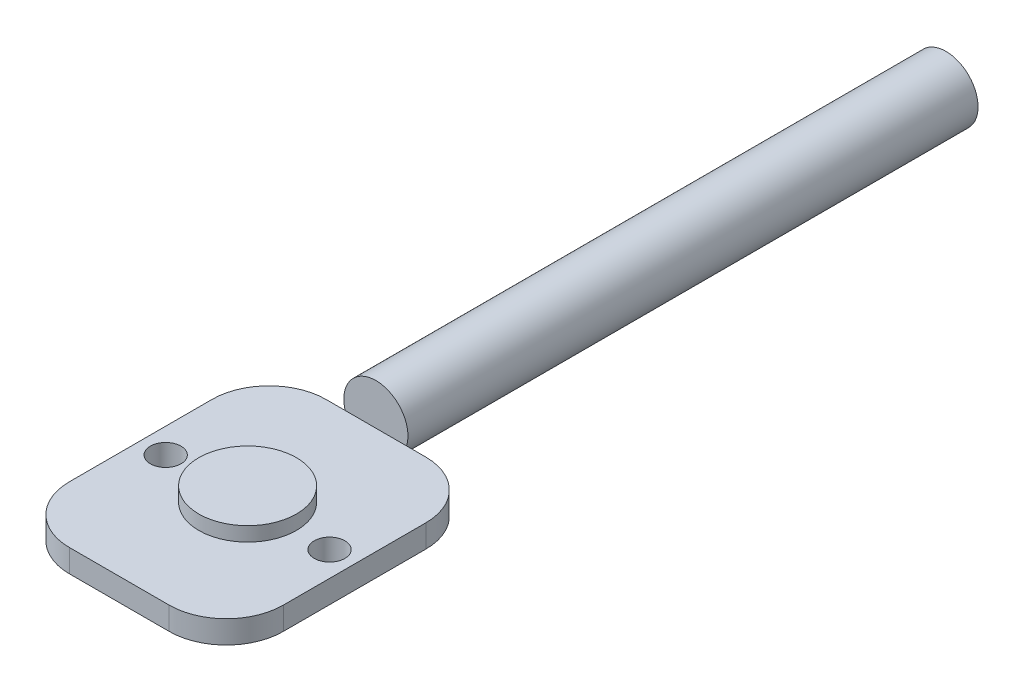
ISO-10303-21;
HEADER;
FILE_DESCRIPTION(('STEP AP214'),'2;1');
FILE_NAME('part.step','',(''),(''),'','','');
FILE_SCHEMA(('AUTOMOTIVE_DESIGN { 1 0 10303 214 1 1 1 1 }'));
ENDSEC;
DATA;
#1=APPLICATION_CONTEXT('core data for automotive mechanical design processes');
#2=APPLICATION_PROTOCOL_DEFINITION('international standard','automotive_design',2000,#1);
#3=PRODUCT_CONTEXT('',#1,'mechanical');
#4=PRODUCT('Part','Part','',(#3));
#5=PRODUCT_RELATED_PRODUCT_CATEGORY('part','',(#4));
#6=PRODUCT_DEFINITION_FORMATION('','',#4);
#7=PRODUCT_DEFINITION_CONTEXT('part definition',#1,'design');
#8=PRODUCT_DEFINITION('design','',#6,#7);
#9=PRODUCT_DEFINITION_SHAPE('','',#8);
#10=(LENGTH_UNIT() NAMED_UNIT(*) SI_UNIT(.MILLI.,.METRE.));
#11=(NAMED_UNIT(*) PLANE_ANGLE_UNIT() SI_UNIT($,.RADIAN.));
#12=(NAMED_UNIT(*) SI_UNIT($,.STERADIAN.) SOLID_ANGLE_UNIT());
#13=UNCERTAINTY_MEASURE_WITH_UNIT(LENGTH_MEASURE(1.E-05),#10,'distance_accuracy_value','');
#14=(GEOMETRIC_REPRESENTATION_CONTEXT(3) GLOBAL_UNCERTAINTY_ASSIGNED_CONTEXT((#13)) GLOBAL_UNIT_ASSIGNED_CONTEXT((#10,
#11,#12)) REPRESENTATION_CONTEXT('',''));
#15=CARTESIAN_POINT('',(0.,0.,0.));
#16=DIRECTION('',(0.,0.,1.));
#17=DIRECTION('',(1.,0.,0.));
#18=AXIS2_PLACEMENT_3D('',#15,#16,#17);
#19=CARTESIAN_POINT('',(0.,2.25,-49.));
#20=DIRECTION('',(0.,0.,1.));
#21=DIRECTION('',(1.,0.,0.));
#22=AXIS2_PLACEMENT_3D('',#19,#20,#21);
#23=CYLINDRICAL_SURFACE('',#22,2.25);
#24=CARTESIAN_POINT('',(0.,2.25,-49.));
#25=DIRECTION('',(0.,0.,-1.));
#26=DIRECTION('',(-1.,0.,0.));
#27=AXIS2_PLACEMENT_3D('',#24,#25,#26);
#28=CIRCLE('',#27,2.25);
#29=CARTESIAN_POINT('',(-2.25,2.25,-49.));
#30=VERTEX_POINT('',#29);
#31=EDGE_CURVE('E11',#30,#30,#28,.T.);
#32=ORIENTED_EDGE('',*,*,#31,.F.);
#33=EDGE_LOOP('',(#32));
#34=FACE_BOUND('',#33,.T.);
#35=CARTESIAN_POINT('',(0.,2.25,-9.));
#36=DIRECTION('',(0.,0.,-1.));
#37=DIRECTION('',(-1.,0.,0.));
#38=AXIS2_PLACEMENT_3D('',#35,#36,#37);
#39=CIRCLE('',#38,2.25);
#40=CARTESIAN_POINT('',(-2.25,2.25,-9.));
#41=VERTEX_POINT('',#40);
#42=EDGE_CURVE('E50',#41,#41,#39,.T.);
#43=ORIENTED_EDGE('',*,*,#42,.T.);
#44=EDGE_LOOP('',(#43));
#45=FACE_BOUND('',#44,.T.);
#46=ADVANCED_FACE('F47',(#34,#45),#23,.T.);
#47=CARTESIAN_POINT('',(0.,2.25,-49.));
#48=DIRECTION('',(0.,0.,-1.));
#49=DIRECTION('',(-1.,0.,0.));
#50=AXIS2_PLACEMENT_3D('',#47,#48,#49);
#51=PLANE('',#50);
#52=ORIENTED_EDGE('',*,*,#31,.T.);
#53=EDGE_LOOP('',(#52));
#54=FACE_BOUND('',#53,.T.);
#55=ADVANCED_FACE('F62',(#54),#51,.T.);
#56=CARTESIAN_POINT('',(0.,2.25,-9.));
#57=DIRECTION('',(0.,0.,-1.));
#58=DIRECTION('',(-1.,0.,0.));
#59=AXIS2_PLACEMENT_3D('',#56,#57,#58);
#60=PLANE('',#59);
#61=ORIENTED_EDGE('',*,*,#42,.F.);
#62=EDGE_LOOP('',(#61));
#63=FACE_BOUND('',#62,.T.);
#64=ADVANCED_FACE('F60',(#63),#60,.F.);
#65=CLOSED_SHELL('',(#46,#55,#64));
#66=MANIFOLD_SOLID_BREP('B2',#65);
#67=CARTESIAN_POINT('',(-3.5,1.6,5.));
#68=DIRECTION('',(0.,-1.,0.));
#69=DIRECTION('',(0.,0.,-1.));
#70=AXIS2_PLACEMENT_3D('',#67,#68,#69);
#71=PLANE('',#70);
#72=CARTESIAN_POINT('',(0.,1.6,0.));
#73=DIRECTION('',(0.,1.,0.));
#74=DIRECTION('',(0.,0.,1.));
#75=AXIS2_PLACEMENT_3D('',#72,#73,#74);
#76=CIRCLE('',#75,3.42647578680288);
#77=CARTESIAN_POINT('',(0.,1.6,3.42647578680288));
#78=VERTEX_POINT('',#77);
#79=EDGE_CURVE('E45',#78,#78,#76,.T.);
#80=ORIENTED_EDGE('',*,*,#79,.F.);
#81=EDGE_LOOP('',(#80));
#82=FACE_BOUND('',#81,.T.);
#83=CARTESIAN_POINT('',(-3.5,1.6,5.));
#84=DIRECTION('',(0.,1.,0.));
#85=DIRECTION('',(0.,0.,-1.));
#86=AXIS2_PLACEMENT_3D('',#83,#84,#85);
#87=CIRCLE('',#86,4.);
#88=CARTESIAN_POINT('',(-7.5,1.6,4.99999999999997));
#89=VERTEX_POINT('',#88);
#90=CARTESIAN_POINT('',(-3.49999999999997,1.6,9.));
#91=VERTEX_POINT('',#90);
#92=EDGE_CURVE('E207',#89,#91,#87,.T.);
#93=ORIENTED_EDGE('',*,*,#92,.T.);
#94=DIRECTION('',(1.,0.,0.));
#95=VECTOR('',#94,1.);
#96=CARTESIAN_POINT('',(3.49999999999997,1.6,9.));
#97=LINE('',#96,#95);
#98=CARTESIAN_POINT('',(3.49999999999997,1.6,9.));
#99=VERTEX_POINT('',#98);
#100=EDGE_CURVE('E155',#91,#99,#97,.T.);
#101=ORIENTED_EDGE('',*,*,#100,.T.);
#102=CARTESIAN_POINT('',(3.5,1.6,5.));
#103=DIRECTION('',(0.,1.,0.));
#104=DIRECTION('',(0.,0.,-1.));
#105=AXIS2_PLACEMENT_3D('',#102,#103,#104);
#106=CIRCLE('',#105,4.);
#107=CARTESIAN_POINT('',(7.5,1.6,4.99999999999997));
#108=VERTEX_POINT('',#107);
#109=EDGE_CURVE('E238',#99,#108,#106,.T.);
#110=ORIENTED_EDGE('',*,*,#109,.T.);
#111=DIRECTION('',(0.,0.,-1.));
#112=VECTOR('',#111,1.);
#113=CARTESIAN_POINT('',(7.5,1.6,-4.99999999999998));
#114=LINE('',#113,#112);
#115=CARTESIAN_POINT('',(7.5,1.6,-4.99999999999998));
#116=VERTEX_POINT('',#115);
#117=EDGE_CURVE('E237',#108,#116,#114,.T.);
#118=ORIENTED_EDGE('',*,*,#117,.T.);
#119=CARTESIAN_POINT('',(3.5,1.6,-5.));
#120=DIRECTION('',(0.,1.,0.));
#121=DIRECTION('',(0.,0.,1.));
#122=AXIS2_PLACEMENT_3D('',#119,#120,#121);
#123=CIRCLE('',#122,4.);
#124=CARTESIAN_POINT('',(3.49999999999997,1.6,-9.00000000000001));
#125=VERTEX_POINT('',#124);
#126=EDGE_CURVE('E174',#116,#125,#123,.T.);
#127=ORIENTED_EDGE('',*,*,#126,.T.);
#128=DIRECTION('',(-1.,0.,0.));
#129=VECTOR('',#128,1.);
#130=CARTESIAN_POINT('',(-3.49999999999997,1.6,-9.));
#131=LINE('',#130,#129);
#132=CARTESIAN_POINT('',(-3.49999999999997,1.6,-9.));
#133=VERTEX_POINT('',#132);
#134=EDGE_CURVE('E168',#125,#133,#131,.T.);
#135=ORIENTED_EDGE('',*,*,#134,.T.);
#136=CARTESIAN_POINT('',(-3.5,1.6,-5.));
#137=DIRECTION('',(0.,1.,0.));
#138=DIRECTION('',(0.,0.,1.));
#139=AXIS2_PLACEMENT_3D('',#136,#137,#138);
#140=CIRCLE('',#139,4.);
#141=CARTESIAN_POINT('',(-7.5,1.6,-4.99999999999998));
#142=VERTEX_POINT('',#141);
#143=EDGE_CURVE('E172',#133,#142,#140,.T.);
#144=ORIENTED_EDGE('',*,*,#143,.T.);
#145=DIRECTION('',(0.,0.,1.));
#146=VECTOR('',#145,1.);
#147=CARTESIAN_POINT('',(-7.5,1.6,4.99999999999997));
#148=LINE('',#147,#146);
#149=EDGE_CURVE('E111',#142,#89,#148,.T.);
#150=ORIENTED_EDGE('',*,*,#149,.T.);
#151=EDGE_LOOP('',(#93,#101,#110,#118,#127,#135,#144,#150));
#152=FACE_BOUND('',#151,.T.);
#153=CARTESIAN_POINT('',(-5.75,1.6,0.));
#154=DIRECTION('',(0.,1.,0.));
#155=DIRECTION('',(0.,0.,1.));
#156=AXIS2_PLACEMENT_3D('',#153,#154,#155);
#157=CIRCLE('',#156,1.075);
#158=CARTESIAN_POINT('',(-5.75,1.6,1.075));
#159=VERTEX_POINT('',#158);
#160=EDGE_CURVE('E196',#159,#159,#157,.T.);
#161=ORIENTED_EDGE('',*,*,#160,.F.);
#162=EDGE_LOOP('',(#161));
#163=FACE_BOUND('',#162,.T.);
#164=CARTESIAN_POINT('',(5.75,1.6,0.));
#165=DIRECTION('',(0.,1.,0.));
#166=DIRECTION('',(0.,0.,1.));
#167=AXIS2_PLACEMENT_3D('',#164,#165,#166);
#168=CIRCLE('',#167,1.075);
#169=CARTESIAN_POINT('',(5.75,1.6,1.075));
#170=VERTEX_POINT('',#169);
#171=EDGE_CURVE('E247',#170,#170,#168,.T.);
#172=ORIENTED_EDGE('',*,*,#171,.F.);
#173=EDGE_LOOP('',(#172));
#174=FACE_BOUND('',#173,.T.);
#175=ADVANCED_FACE('F93',(#82,#152,#163,#174),#71,.F.);
#176=CARTESIAN_POINT('',(-3.5,0.,5.));
#177=DIRECTION('',(0.,-1.,0.));
#178=DIRECTION('',(0.,0.,-1.));
#179=AXIS2_PLACEMENT_3D('',#176,#177,#178);
#180=PLANE('',#179);
#181=CARTESIAN_POINT('',(-5.75,0.,0.));
#182=DIRECTION('',(0.,1.,0.));
#183=DIRECTION('',(0.,0.,1.));
#184=AXIS2_PLACEMENT_3D('',#181,#182,#183);
#185=CIRCLE('',#184,1.075);
#186=CARTESIAN_POINT('',(-5.75,0.,1.075));
#187=VERTEX_POINT('',#186);
#188=EDGE_CURVE('E244',#187,#187,#185,.T.);
#189=ORIENTED_EDGE('',*,*,#188,.T.);
#190=EDGE_LOOP('',(#189));
#191=FACE_BOUND('',#190,.T.);
#192=CARTESIAN_POINT('',(-3.5,0.,5.));
#193=DIRECTION('',(0.,1.,0.));
#194=DIRECTION('',(0.,0.,-1.));
#195=AXIS2_PLACEMENT_3D('',#192,#193,#194);
#196=CIRCLE('',#195,4.);
#197=CARTESIAN_POINT('',(-7.5,0.,4.99999999999997));
#198=VERTEX_POINT('',#197);
#199=CARTESIAN_POINT('',(-3.49999999999997,0.,9.));
#200=VERTEX_POINT('',#199);
#201=EDGE_CURVE('E192',#198,#200,#196,.T.);
#202=ORIENTED_EDGE('',*,*,#201,.F.);
#203=DIRECTION('',(0.,0.,1.));
#204=VECTOR('',#203,1.);
#205=CARTESIAN_POINT('',(-7.5,0.,4.99999999999997));
#206=LINE('',#205,#204);
#207=CARTESIAN_POINT('',(-7.5,0.,-4.99999999999998));
#208=VERTEX_POINT('',#207);
#209=EDGE_CURVE('E146',#208,#198,#206,.T.);
#210=ORIENTED_EDGE('',*,*,#209,.F.);
#211=CARTESIAN_POINT('',(-3.5,0.,-5.));
#212=DIRECTION('',(0.,1.,0.));
#213=DIRECTION('',(0.,0.,1.));
#214=AXIS2_PLACEMENT_3D('',#211,#212,#213);
#215=CIRCLE('',#214,4.);
#216=CARTESIAN_POINT('',(-3.49999999999997,0.,-9.));
#217=VERTEX_POINT('',#216);
#218=EDGE_CURVE('E140',#217,#208,#215,.T.);
#219=ORIENTED_EDGE('',*,*,#218,.F.);
#220=DIRECTION('',(-1.,0.,0.));
#221=VECTOR('',#220,1.);
#222=CARTESIAN_POINT('',(-3.49999999999997,0.,-9.));
#223=LINE('',#222,#221);
#224=CARTESIAN_POINT('',(3.49999999999997,0.,-9.00000000000001));
#225=VERTEX_POINT('',#224);
#226=EDGE_CURVE('E182',#225,#217,#223,.T.);
#227=ORIENTED_EDGE('',*,*,#226,.F.);
#228=CARTESIAN_POINT('',(3.5,0.,-5.));
#229=DIRECTION('',(0.,1.,0.));
#230=DIRECTION('',(0.,0.,1.));
#231=AXIS2_PLACEMENT_3D('',#228,#229,#230);
#232=CIRCLE('',#231,4.);
#233=CARTESIAN_POINT('',(7.5,0.,-4.99999999999998));
#234=VERTEX_POINT('',#233);
#235=EDGE_CURVE('E202',#234,#225,#232,.T.);
#236=ORIENTED_EDGE('',*,*,#235,.F.);
#237=DIRECTION('',(0.,0.,-1.));
#238=VECTOR('',#237,1.);
#239=CARTESIAN_POINT('',(7.5,0.,-4.99999999999998));
#240=LINE('',#239,#238);
#241=CARTESIAN_POINT('',(7.5,0.,4.99999999999997));
#242=VERTEX_POINT('',#241);
#243=EDGE_CURVE('E200',#242,#234,#240,.T.);
#244=ORIENTED_EDGE('',*,*,#243,.F.);
#245=CARTESIAN_POINT('',(3.5,0.,5.));
#246=DIRECTION('',(0.,1.,0.));
#247=DIRECTION('',(0.,0.,-1.));
#248=AXIS2_PLACEMENT_3D('',#245,#246,#247);
#249=CIRCLE('',#248,4.);
#250=CARTESIAN_POINT('',(3.49999999999997,0.,9.));
#251=VERTEX_POINT('',#250);
#252=EDGE_CURVE('E198',#251,#242,#249,.T.);
#253=ORIENTED_EDGE('',*,*,#252,.F.);
#254=DIRECTION('',(1.,0.,0.));
#255=VECTOR('',#254,1.);
#256=CARTESIAN_POINT('',(3.49999999999997,0.,9.));
#257=LINE('',#256,#255);
#258=EDGE_CURVE('E195',#200,#251,#257,.T.);
#259=ORIENTED_EDGE('',*,*,#258,.F.);
#260=EDGE_LOOP('',(#202,#210,#219,#227,#236,#244,#253,#259));
#261=FACE_BOUND('',#260,.T.);
#262=CARTESIAN_POINT('',(5.75,0.,0.));
#263=DIRECTION('',(0.,1.,0.));
#264=DIRECTION('',(0.,0.,1.));
#265=AXIS2_PLACEMENT_3D('',#262,#263,#264);
#266=CIRCLE('',#265,1.075);
#267=CARTESIAN_POINT('',(5.75,0.,1.075));
#268=VERTEX_POINT('',#267);
#269=EDGE_CURVE('E250',#268,#268,#266,.T.);
#270=ORIENTED_EDGE('',*,*,#269,.T.);
#271=EDGE_LOOP('',(#270));
#272=FACE_BOUND('',#271,.T.);
#273=ADVANCED_FACE('F227',(#191,#261,#272),#180,.T.);
#274=CARTESIAN_POINT('',(-3.5,1.6,5.));
#275=DIRECTION('',(0.,-1.,0.));
#276=DIRECTION('',(0.,0.,-1.));
#277=AXIS2_PLACEMENT_3D('',#274,#275,#276);
#278=CYLINDRICAL_SURFACE('',#277,4.);
#279=ORIENTED_EDGE('',*,*,#201,.T.);
#280=DIRECTION('',(0.,-1.,0.));
#281=VECTOR('',#280,1.);
#282=CARTESIAN_POINT('',(-3.49999999999997,1.6,9.));
#283=LINE('',#282,#281);
#284=EDGE_CURVE('E97',#91,#200,#283,.T.);
#285=ORIENTED_EDGE('',*,*,#284,.F.);
#286=ORIENTED_EDGE('',*,*,#92,.F.);
#287=DIRECTION('',(0.,-1.,0.));
#288=VECTOR('',#287,1.);
#289=CARTESIAN_POINT('',(-7.5,1.6,4.99999999999997));
#290=LINE('',#289,#288);
#291=EDGE_CURVE('E188',#89,#198,#290,.T.);
#292=ORIENTED_EDGE('',*,*,#291,.T.);
#293=EDGE_LOOP('',(#279,#285,#286,#292));
#294=FACE_BOUND('',#293,.T.);
#295=ADVANCED_FACE('F95',(#294),#278,.T.);
#296=CARTESIAN_POINT('',(3.49999999999997,1.6,9.));
#297=DIRECTION('',(0.,0.,-1.));
#298=DIRECTION('',(-1.,0.,0.));
#299=AXIS2_PLACEMENT_3D('',#296,#297,#298);
#300=PLANE('',#299);
#301=ORIENTED_EDGE('',*,*,#258,.T.);
#302=DIRECTION('',(0.,-1.,0.));
#303=VECTOR('',#302,1.);
#304=CARTESIAN_POINT('',(3.49999999999997,1.6,9.));
#305=LINE('',#304,#303);
#306=EDGE_CURVE('E216',#99,#251,#305,.T.);
#307=ORIENTED_EDGE('',*,*,#306,.F.);
#308=ORIENTED_EDGE('',*,*,#100,.F.);
#309=ORIENTED_EDGE('',*,*,#284,.T.);
#310=EDGE_LOOP('',(#301,#307,#308,#309));
#311=FACE_BOUND('',#310,.T.);
#312=ADVANCED_FACE('F222',(#311),#300,.F.);
#313=CARTESIAN_POINT('',(3.5,1.6,5.));
#314=DIRECTION('',(0.,-1.,0.));
#315=DIRECTION('',(0.,0.,-1.));
#316=AXIS2_PLACEMENT_3D('',#313,#314,#315);
#317=CYLINDRICAL_SURFACE('',#316,4.);
#318=ORIENTED_EDGE('',*,*,#252,.T.);
#319=DIRECTION('',(0.,-1.,0.));
#320=VECTOR('',#319,1.);
#321=CARTESIAN_POINT('',(7.5,1.6,4.99999999999997));
#322=LINE('',#321,#320);
#323=EDGE_CURVE('E214',#108,#242,#322,.T.);
#324=ORIENTED_EDGE('',*,*,#323,.F.);
#325=ORIENTED_EDGE('',*,*,#109,.F.);
#326=ORIENTED_EDGE('',*,*,#306,.T.);
#327=EDGE_LOOP('',(#318,#324,#325,#326));
#328=FACE_BOUND('',#327,.T.);
#329=ADVANCED_FACE('F232',(#328),#317,.T.);
#330=CARTESIAN_POINT('',(7.5,1.6,-4.99999999999998));
#331=DIRECTION('',(-1.,0.,0.));
#332=DIRECTION('',(0.,0.,1.));
#333=AXIS2_PLACEMENT_3D('',#330,#331,#332);
#334=PLANE('',#333);
#335=ORIENTED_EDGE('',*,*,#243,.T.);
#336=DIRECTION('',(0.,-1.,0.));
#337=VECTOR('',#336,1.);
#338=CARTESIAN_POINT('',(7.5,1.6,-4.99999999999998));
#339=LINE('',#338,#337);
#340=EDGE_CURVE('E211',#116,#234,#339,.T.);
#341=ORIENTED_EDGE('',*,*,#340,.F.);
#342=ORIENTED_EDGE('',*,*,#117,.F.);
#343=ORIENTED_EDGE('',*,*,#323,.T.);
#344=EDGE_LOOP('',(#335,#341,#342,#343));
#345=FACE_BOUND('',#344,.T.);
#346=ADVANCED_FACE('F235',(#345),#334,.F.);
#347=CARTESIAN_POINT('',(3.5,1.6,-5.));
#348=DIRECTION('',(0.,-1.,0.));
#349=DIRECTION('',(0.,0.,-1.));
#350=AXIS2_PLACEMENT_3D('',#347,#348,#349);
#351=CYLINDRICAL_SURFACE('',#350,4.);
#352=ORIENTED_EDGE('',*,*,#235,.T.);
#353=DIRECTION('',(0.,-1.,0.));
#354=VECTOR('',#353,1.);
#355=CARTESIAN_POINT('',(3.49999999999997,1.6,-9.00000000000001));
#356=LINE('',#355,#354);
#357=EDGE_CURVE('E183',#125,#225,#356,.T.);
#358=ORIENTED_EDGE('',*,*,#357,.F.);
#359=ORIENTED_EDGE('',*,*,#126,.F.);
#360=ORIENTED_EDGE('',*,*,#340,.T.);
#361=EDGE_LOOP('',(#352,#358,#359,#360));
#362=FACE_BOUND('',#361,.T.);
#363=ADVANCED_FACE('F286',(#362),#351,.T.);
#364=CARTESIAN_POINT('',(-3.49999999999997,1.6,-9.));
#365=DIRECTION('',(0.,0.,1.));
#366=DIRECTION('',(1.,0.,0.));
#367=AXIS2_PLACEMENT_3D('',#364,#365,#366);
#368=PLANE('',#367);
#369=ORIENTED_EDGE('',*,*,#226,.T.);
#370=DIRECTION('',(0.,-1.,0.));
#371=VECTOR('',#370,1.);
#372=CARTESIAN_POINT('',(-3.49999999999997,1.6,-9.));
#373=LINE('',#372,#371);
#374=EDGE_CURVE('E179',#133,#217,#373,.T.);
#375=ORIENTED_EDGE('',*,*,#374,.F.);
#376=ORIENTED_EDGE('',*,*,#134,.F.);
#377=ORIENTED_EDGE('',*,*,#357,.T.);
#378=EDGE_LOOP('',(#369,#375,#376,#377));
#379=FACE_BOUND('',#378,.T.);
#380=ADVANCED_FACE('F180',(#379),#368,.F.);
#381=CARTESIAN_POINT('',(-3.5,1.6,-5.));
#382=DIRECTION('',(0.,-1.,0.));
#383=DIRECTION('',(0.,0.,-1.));
#384=AXIS2_PLACEMENT_3D('',#381,#382,#383);
#385=CYLINDRICAL_SURFACE('',#384,4.);
#386=ORIENTED_EDGE('',*,*,#218,.T.);
#387=DIRECTION('',(0.,-1.,0.));
#388=VECTOR('',#387,1.);
#389=CARTESIAN_POINT('',(-7.5,1.6,-4.99999999999998));
#390=LINE('',#389,#388);
#391=EDGE_CURVE('E184',#142,#208,#390,.T.);
#392=ORIENTED_EDGE('',*,*,#391,.F.);
#393=ORIENTED_EDGE('',*,*,#143,.F.);
#394=ORIENTED_EDGE('',*,*,#374,.T.);
#395=EDGE_LOOP('',(#386,#392,#393,#394));
#396=FACE_BOUND('',#395,.T.);
#397=ADVANCED_FACE('F186',(#396),#385,.T.);
#398=CARTESIAN_POINT('',(-7.5,1.6,4.99999999999997));
#399=DIRECTION('',(1.,0.,0.));
#400=DIRECTION('',(0.,0.,-1.));
#401=AXIS2_PLACEMENT_3D('',#398,#399,#400);
#402=PLANE('',#401);
#403=ORIENTED_EDGE('',*,*,#209,.T.);
#404=ORIENTED_EDGE('',*,*,#291,.F.);
#405=ORIENTED_EDGE('',*,*,#149,.F.);
#406=ORIENTED_EDGE('',*,*,#391,.T.);
#407=EDGE_LOOP('',(#403,#404,#405,#406));
#408=FACE_BOUND('',#407,.T.);
#409=ADVANCED_FACE('F279',(#408),#402,.F.);
#410=CARTESIAN_POINT('',(-5.75,1.6,0.));
#411=DIRECTION('',(0.,-1.,0.));
#412=DIRECTION('',(0.,0.,-1.));
#413=AXIS2_PLACEMENT_3D('',#410,#411,#412);
#414=CYLINDRICAL_SURFACE('',#413,1.075);
#415=ORIENTED_EDGE('',*,*,#160,.T.);
#416=EDGE_LOOP('',(#415));
#417=FACE_BOUND('',#416,.T.);
#418=ORIENTED_EDGE('',*,*,#188,.F.);
#419=EDGE_LOOP('',(#418));
#420=FACE_BOUND('',#419,.T.);
#421=ADVANCED_FACE('F276',(#417,#420),#414,.F.);
#422=CARTESIAN_POINT('',(5.75,1.6,0.));
#423=DIRECTION('',(0.,-1.,0.));
#424=DIRECTION('',(0.,0.,-1.));
#425=AXIS2_PLACEMENT_3D('',#422,#423,#424);
#426=CYLINDRICAL_SURFACE('',#425,1.075);
#427=ORIENTED_EDGE('',*,*,#171,.T.);
#428=EDGE_LOOP('',(#427));
#429=FACE_BOUND('',#428,.T.);
#430=ORIENTED_EDGE('',*,*,#269,.F.);
#431=EDGE_LOOP('',(#430));
#432=FACE_BOUND('',#431,.T.);
#433=ADVANCED_FACE('F264',(#429,#432),#426,.F.);
#434=CARTESIAN_POINT('',(0.,2.6,0.));
#435=DIRECTION('',(0.,-1.,0.));
#436=DIRECTION('',(0.,0.,-1.));
#437=AXIS2_PLACEMENT_3D('',#434,#435,#436);
#438=CYLINDRICAL_SURFACE('',#437,3.42647578680288);
#439=CARTESIAN_POINT('',(0.,2.6,0.));
#440=DIRECTION('',(0.,1.,0.));
#441=DIRECTION('',(0.,0.,1.));
#442=AXIS2_PLACEMENT_3D('',#439,#440,#441);
#443=CIRCLE('',#442,3.42647578680288);
#444=CARTESIAN_POINT('',(0.,2.6,3.42647578680288));
#445=VERTEX_POINT('',#444);
#446=EDGE_CURVE('E253',#445,#445,#443,.T.);
#447=ORIENTED_EDGE('',*,*,#446,.F.);
#448=EDGE_LOOP('',(#447));
#449=FACE_BOUND('',#448,.T.);
#450=ORIENTED_EDGE('',*,*,#79,.T.);
#451=EDGE_LOOP('',(#450));
#452=FACE_BOUND('',#451,.T.);
#453=ADVANCED_FACE('F261',(#449,#452),#438,.T.);
#454=CARTESIAN_POINT('',(0.,2.6,0.));
#455=DIRECTION('',(0.,1.,0.));
#456=DIRECTION('',(0.,0.,1.));
#457=AXIS2_PLACEMENT_3D('',#454,#455,#456);
#458=PLANE('',#457);
#459=ORIENTED_EDGE('',*,*,#446,.T.);
#460=EDGE_LOOP('',(#459));
#461=FACE_BOUND('',#460,.T.);
#462=ADVANCED_FACE('F259',(#461),#458,.T.);
#463=CLOSED_SHELL('',(#175,#273,#295,#312,#329,#346,#363,#380,#397,#409,#421,#433,#453,#462));
#464=MANIFOLD_SOLID_BREP('B6',#463);
#465=ADVANCED_BREP_SHAPE_REPRESENTATION('',(#18,#66,#464),#14);
#466=SHAPE_DEFINITION_REPRESENTATION(#9,#465);
ENDSEC;
END-ISO-10303-21;
